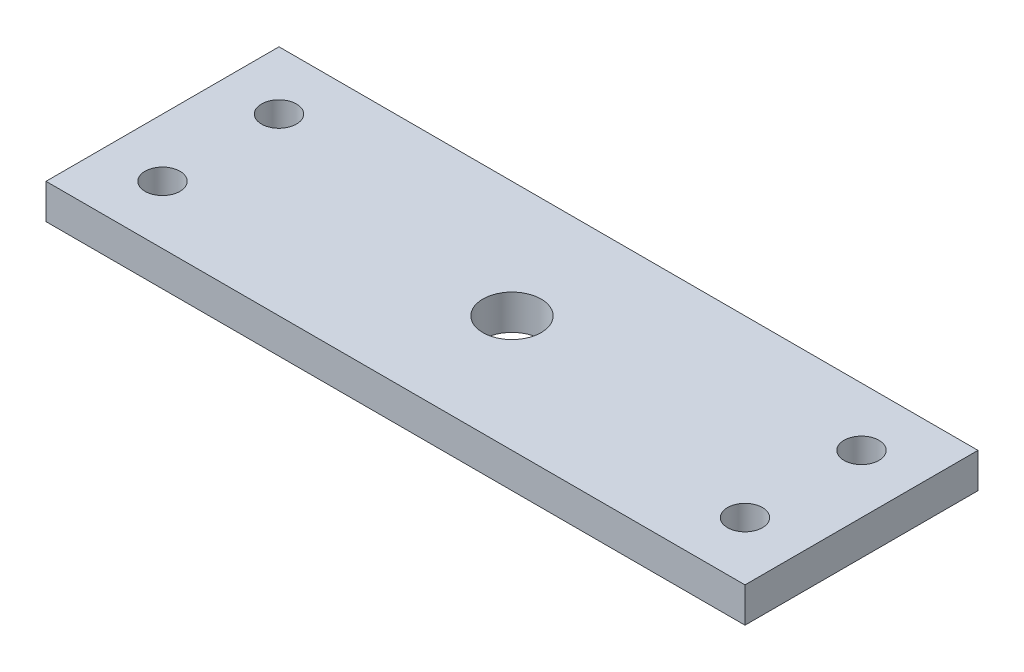
ISO-10303-21;
HEADER;
FILE_DESCRIPTION(('STEP AP214'),'2;1');
FILE_NAME('part.step','',(''),(''),'','','');
FILE_SCHEMA(('AUTOMOTIVE_DESIGN { 1 0 10303 214 1 1 1 1 }'));
ENDSEC;
DATA;
#1=APPLICATION_CONTEXT('core data for automotive mechanical design processes');
#2=APPLICATION_PROTOCOL_DEFINITION('international standard','automotive_design',2000,#1);
#3=PRODUCT_CONTEXT('',#1,'mechanical');
#4=PRODUCT('Part','Part','',(#3));
#5=PRODUCT_RELATED_PRODUCT_CATEGORY('part','',(#4));
#6=PRODUCT_DEFINITION_FORMATION('','',#4);
#7=PRODUCT_DEFINITION_CONTEXT('part definition',#1,'design');
#8=PRODUCT_DEFINITION('design','',#6,#7);
#9=PRODUCT_DEFINITION_SHAPE('','',#8);
#10=(LENGTH_UNIT() NAMED_UNIT(*) SI_UNIT(.MILLI.,.METRE.));
#11=(NAMED_UNIT(*) PLANE_ANGLE_UNIT() SI_UNIT($,.RADIAN.));
#12=(NAMED_UNIT(*) SI_UNIT($,.STERADIAN.) SOLID_ANGLE_UNIT());
#13=UNCERTAINTY_MEASURE_WITH_UNIT(LENGTH_MEASURE(1.E-05),#10,'distance_accuracy_value','');
#14=(GEOMETRIC_REPRESENTATION_CONTEXT(3) GLOBAL_UNCERTAINTY_ASSIGNED_CONTEXT((#13)) GLOBAL_UNIT_ASSIGNED_CONTEXT((#10,
#11,#12)) REPRESENTATION_CONTEXT('',''));
#15=CARTESIAN_POINT('',(0.,0.,0.));
#16=DIRECTION('',(0.,0.,1.));
#17=DIRECTION('',(1.,0.,0.));
#18=AXIS2_PLACEMENT_3D('',#15,#16,#17);
#19=CARTESIAN_POINT('',(0.,3.,0.));
#20=DIRECTION('',(0.,1.,0.));
#21=DIRECTION('',(0.,0.,1.));
#22=AXIS2_PLACEMENT_3D('',#19,#20,#21);
#23=PLANE('',#22);
#24=CARTESIAN_POINT('',(-5.,3.,-15.));
#25=DIRECTION('',(0.,1.,0.));
#26=DIRECTION('',(0.,0.,-1.));
#27=AXIS2_PLACEMENT_3D('',#24,#25,#26);
#28=CIRCLE('',#27,1.5);
#29=CARTESIAN_POINT('',(-5.,3.,-16.5));
#30=VERTEX_POINT('',#29);
#31=EDGE_CURVE('E154',#30,#30,#28,.T.);
#32=ORIENTED_EDGE('',*,*,#31,.F.);
#33=EDGE_LOOP('',(#32));
#34=FACE_BOUND('',#33,.T.);
#35=CARTESIAN_POINT('',(-55.,3.,-15.));
#36=DIRECTION('',(0.,1.,0.));
#37=DIRECTION('',(0.,0.,1.));
#38=AXIS2_PLACEMENT_3D('',#35,#36,#37);
#39=CIRCLE('',#38,1.5);
#40=CARTESIAN_POINT('',(-55.,3.,-13.5));
#41=VERTEX_POINT('',#40);
#42=EDGE_CURVE('E138',#41,#41,#39,.T.);
#43=ORIENTED_EDGE('',*,*,#42,.F.);
#44=EDGE_LOOP('',(#43));
#45=FACE_BOUND('',#44,.T.);
#46=DIRECTION('',(0.,0.,1.));
#47=VECTOR('',#46,1.);
#48=CARTESIAN_POINT('',(-60.,3.,-20.));
#49=LINE('',#48,#47);
#50=CARTESIAN_POINT('',(-60.,3.,-20.));
#51=VERTEX_POINT('',#50);
#52=CARTESIAN_POINT('',(-60.,3.,0.));
#53=VERTEX_POINT('',#52);
#54=EDGE_CURVE('E96',#51,#53,#49,.T.);
#55=ORIENTED_EDGE('',*,*,#54,.T.);
#56=DIRECTION('',(1.,0.,0.));
#57=VECTOR('',#56,1.);
#58=CARTESIAN_POINT('',(-60.,3.,0.));
#59=LINE('',#58,#57);
#60=CARTESIAN_POINT('',(0.,3.,0.));
#61=VERTEX_POINT('',#60);
#62=EDGE_CURVE('E91',#53,#61,#59,.T.);
#63=ORIENTED_EDGE('',*,*,#62,.T.);
#64=DIRECTION('',(0.,0.,-1.));
#65=VECTOR('',#64,1.);
#66=CARTESIAN_POINT('',(0.,3.,-20.));
#67=LINE('',#66,#65);
#68=CARTESIAN_POINT('',(0.,3.,-20.));
#69=VERTEX_POINT('',#68);
#70=EDGE_CURVE('E94',#61,#69,#67,.T.);
#71=ORIENTED_EDGE('',*,*,#70,.T.);
#72=DIRECTION('',(-1.,0.,0.));
#73=VECTOR('',#72,1.);
#74=CARTESIAN_POINT('',(-60.,3.,-20.));
#75=LINE('',#74,#73);
#76=EDGE_CURVE('E61',#69,#51,#75,.T.);
#77=ORIENTED_EDGE('',*,*,#76,.T.);
#78=EDGE_LOOP('',(#55,#63,#71,#77));
#79=FACE_BOUND('',#78,.T.);
#80=CARTESIAN_POINT('',(-30.,3.,-10.));
#81=DIRECTION('',(0.,1.,0.));
#82=DIRECTION('',(0.,0.,1.));
#83=AXIS2_PLACEMENT_3D('',#80,#81,#82);
#84=CIRCLE('',#83,2.5);
#85=CARTESIAN_POINT('',(-30.,3.,-7.5));
#86=VERTEX_POINT('',#85);
#87=EDGE_CURVE('E116',#86,#86,#84,.T.);
#88=ORIENTED_EDGE('',*,*,#87,.F.);
#89=EDGE_LOOP('',(#88));
#90=FACE_BOUND('',#89,.T.);
#91=CARTESIAN_POINT('',(-55.,3.,-4.99999999999999));
#92=DIRECTION('',(0.,1.,0.));
#93=DIRECTION('',(0.,0.,-1.));
#94=AXIS2_PLACEMENT_3D('',#91,#92,#93);
#95=CIRCLE('',#94,1.5);
#96=CARTESIAN_POINT('',(-55.,3.,-6.5));
#97=VERTEX_POINT('',#96);
#98=EDGE_CURVE('E146',#97,#97,#95,.T.);
#99=ORIENTED_EDGE('',*,*,#98,.F.);
#100=EDGE_LOOP('',(#99));
#101=FACE_BOUND('',#100,.T.);
#102=CARTESIAN_POINT('',(-5.,3.,-5.00000000000002));
#103=DIRECTION('',(0.,1.,0.));
#104=DIRECTION('',(0.,0.,1.));
#105=AXIS2_PLACEMENT_3D('',#102,#103,#104);
#106=CIRCLE('',#105,1.5);
#107=CARTESIAN_POINT('',(-5.,3.,-3.50000000000001));
#108=VERTEX_POINT('',#107);
#109=EDGE_CURVE('E162',#108,#108,#106,.T.);
#110=ORIENTED_EDGE('',*,*,#109,.F.);
#111=EDGE_LOOP('',(#110));
#112=FACE_BOUND('',#111,.T.);
#113=ADVANCED_FACE('F43',(#34,#45,#79,#90,#101,#112),#23,.T.);
#114=CARTESIAN_POINT('',(0.,0.,0.));
#115=DIRECTION('',(0.,1.,0.));
#116=DIRECTION('',(0.,0.,1.));
#117=AXIS2_PLACEMENT_3D('',#114,#115,#116);
#118=PLANE('',#117);
#119=DIRECTION('',(0.,0.,1.));
#120=VECTOR('',#119,1.);
#121=CARTESIAN_POINT('',(-60.,0.,-20.));
#122=LINE('',#121,#120);
#123=CARTESIAN_POINT('',(-60.,0.,-20.));
#124=VERTEX_POINT('',#123);
#125=CARTESIAN_POINT('',(-60.,0.,0.));
#126=VERTEX_POINT('',#125);
#127=EDGE_CURVE('E112',#124,#126,#122,.T.);
#128=ORIENTED_EDGE('',*,*,#127,.F.);
#129=DIRECTION('',(-1.,0.,0.));
#130=VECTOR('',#129,1.);
#131=CARTESIAN_POINT('',(-60.,0.,-20.));
#132=LINE('',#131,#130);
#133=CARTESIAN_POINT('',(0.,0.,-20.));
#134=VERTEX_POINT('',#133);
#135=EDGE_CURVE('E84',#134,#124,#132,.T.);
#136=ORIENTED_EDGE('',*,*,#135,.F.);
#137=DIRECTION('',(0.,0.,-1.));
#138=VECTOR('',#137,1.);
#139=CARTESIAN_POINT('',(0.,0.,-20.));
#140=LINE('',#139,#138);
#141=CARTESIAN_POINT('',(0.,0.,0.));
#142=VERTEX_POINT('',#141);
#143=EDGE_CURVE('E78',#142,#134,#140,.T.);
#144=ORIENTED_EDGE('',*,*,#143,.F.);
#145=DIRECTION('',(1.,0.,0.));
#146=VECTOR('',#145,1.);
#147=CARTESIAN_POINT('',(-60.,0.,0.));
#148=LINE('',#147,#146);
#149=EDGE_CURVE('E101',#126,#142,#148,.T.);
#150=ORIENTED_EDGE('',*,*,#149,.F.);
#151=EDGE_LOOP('',(#128,#136,#144,#150));
#152=FACE_BOUND('',#151,.T.);
#153=CARTESIAN_POINT('',(-30.,0.,-10.));
#154=DIRECTION('',(0.,1.,0.));
#155=DIRECTION('',(0.,0.,1.));
#156=AXIS2_PLACEMENT_3D('',#153,#154,#155);
#157=CIRCLE('',#156,2.5);
#158=CARTESIAN_POINT('',(-30.,0.,-7.5));
#159=VERTEX_POINT('',#158);
#160=EDGE_CURVE('E134',#159,#159,#157,.T.);
#161=ORIENTED_EDGE('',*,*,#160,.T.);
#162=EDGE_LOOP('',(#161));
#163=FACE_BOUND('',#162,.T.);
#164=CARTESIAN_POINT('',(-55.,0.,-15.));
#165=DIRECTION('',(0.,1.,0.));
#166=DIRECTION('',(0.,0.,1.));
#167=AXIS2_PLACEMENT_3D('',#164,#165,#166);
#168=CIRCLE('',#167,1.5);
#169=CARTESIAN_POINT('',(-55.,0.,-13.5));
#170=VERTEX_POINT('',#169);
#171=EDGE_CURVE('E142',#170,#170,#168,.T.);
#172=ORIENTED_EDGE('',*,*,#171,.T.);
#173=EDGE_LOOP('',(#172));
#174=FACE_BOUND('',#173,.T.);
#175=CARTESIAN_POINT('',(-55.,0.,-4.99999999999999));
#176=DIRECTION('',(0.,1.,0.));
#177=DIRECTION('',(0.,0.,-1.));
#178=AXIS2_PLACEMENT_3D('',#175,#176,#177);
#179=CIRCLE('',#178,1.5);
#180=CARTESIAN_POINT('',(-55.,0.,-6.5));
#181=VERTEX_POINT('',#180);
#182=EDGE_CURVE('E150',#181,#181,#179,.T.);
#183=ORIENTED_EDGE('',*,*,#182,.T.);
#184=EDGE_LOOP('',(#183));
#185=FACE_BOUND('',#184,.T.);
#186=CARTESIAN_POINT('',(-5.,0.,-15.));
#187=DIRECTION('',(0.,1.,0.));
#188=DIRECTION('',(0.,0.,-1.));
#189=AXIS2_PLACEMENT_3D('',#186,#187,#188);
#190=CIRCLE('',#189,1.5);
#191=CARTESIAN_POINT('',(-5.,0.,-16.5));
#192=VERTEX_POINT('',#191);
#193=EDGE_CURVE('E158',#192,#192,#190,.T.);
#194=ORIENTED_EDGE('',*,*,#193,.T.);
#195=EDGE_LOOP('',(#194));
#196=FACE_BOUND('',#195,.T.);
#197=CARTESIAN_POINT('',(-5.,0.,-5.00000000000002));
#198=DIRECTION('',(0.,1.,0.));
#199=DIRECTION('',(0.,0.,1.));
#200=AXIS2_PLACEMENT_3D('',#197,#198,#199);
#201=CIRCLE('',#200,1.5);
#202=CARTESIAN_POINT('',(-5.,0.,-3.50000000000001));
#203=VERTEX_POINT('',#202);
#204=EDGE_CURVE('E166',#203,#203,#201,.T.);
#205=ORIENTED_EDGE('',*,*,#204,.T.);
#206=EDGE_LOOP('',(#205));
#207=FACE_BOUND('',#206,.T.);
#208=ADVANCED_FACE('F129',(#152,#163,#174,#185,#196,#207),#118,.F.);
#209=CARTESIAN_POINT('',(-60.,3.,-20.));
#210=DIRECTION('',(1.,0.,0.));
#211=DIRECTION('',(0.,0.,-1.));
#212=AXIS2_PLACEMENT_3D('',#209,#210,#211);
#213=PLANE('',#212);
#214=ORIENTED_EDGE('',*,*,#127,.T.);
#215=DIRECTION('',(0.,-1.,0.));
#216=VECTOR('',#215,1.);
#217=CARTESIAN_POINT('',(-60.,3.,0.));
#218=LINE('',#217,#216);
#219=EDGE_CURVE('E11',#53,#126,#218,.T.);
#220=ORIENTED_EDGE('',*,*,#219,.F.);
#221=ORIENTED_EDGE('',*,*,#54,.F.);
#222=DIRECTION('',(0.,-1.,0.));
#223=VECTOR('',#222,1.);
#224=CARTESIAN_POINT('',(-60.,3.,-20.));
#225=LINE('',#224,#223);
#226=EDGE_CURVE('E108',#51,#124,#225,.T.);
#227=ORIENTED_EDGE('',*,*,#226,.T.);
#228=EDGE_LOOP('',(#214,#220,#221,#227));
#229=FACE_BOUND('',#228,.T.);
#230=ADVANCED_FACE('F45',(#229),#213,.F.);
#231=CARTESIAN_POINT('',(-60.,3.,0.));
#232=DIRECTION('',(0.,0.,-1.));
#233=DIRECTION('',(-1.,0.,0.));
#234=AXIS2_PLACEMENT_3D('',#231,#232,#233);
#235=PLANE('',#234);
#236=ORIENTED_EDGE('',*,*,#149,.T.);
#237=DIRECTION('',(0.,-1.,0.));
#238=VECTOR('',#237,1.);
#239=CARTESIAN_POINT('',(0.,3.,0.));
#240=LINE('',#239,#238);
#241=EDGE_CURVE('E53',#61,#142,#240,.T.);
#242=ORIENTED_EDGE('',*,*,#241,.F.);
#243=ORIENTED_EDGE('',*,*,#62,.F.);
#244=ORIENTED_EDGE('',*,*,#219,.T.);
#245=EDGE_LOOP('',(#236,#242,#243,#244));
#246=FACE_BOUND('',#245,.T.);
#247=ADVANCED_FACE('F100',(#246),#235,.F.);
#248=CARTESIAN_POINT('',(0.,3.,-20.));
#249=DIRECTION('',(-1.,0.,0.));
#250=DIRECTION('',(0.,0.,1.));
#251=AXIS2_PLACEMENT_3D('',#248,#249,#250);
#252=PLANE('',#251);
#253=ORIENTED_EDGE('',*,*,#143,.T.);
#254=DIRECTION('',(0.,-1.,0.));
#255=VECTOR('',#254,1.);
#256=CARTESIAN_POINT('',(0.,3.,-20.));
#257=LINE('',#256,#255);
#258=EDGE_CURVE('E103',#69,#134,#257,.T.);
#259=ORIENTED_EDGE('',*,*,#258,.F.);
#260=ORIENTED_EDGE('',*,*,#70,.F.);
#261=ORIENTED_EDGE('',*,*,#241,.T.);
#262=EDGE_LOOP('',(#253,#259,#260,#261));
#263=FACE_BOUND('',#262,.T.);
#264=ADVANCED_FACE('F104',(#263),#252,.F.);
#265=CARTESIAN_POINT('',(-60.,3.,-20.));
#266=DIRECTION('',(0.,0.,1.));
#267=DIRECTION('',(1.,0.,0.));
#268=AXIS2_PLACEMENT_3D('',#265,#266,#267);
#269=PLANE('',#268);
#270=ORIENTED_EDGE('',*,*,#135,.T.);
#271=ORIENTED_EDGE('',*,*,#226,.F.);
#272=ORIENTED_EDGE('',*,*,#76,.F.);
#273=ORIENTED_EDGE('',*,*,#258,.T.);
#274=EDGE_LOOP('',(#270,#271,#272,#273));
#275=FACE_BOUND('',#274,.T.);
#276=ADVANCED_FACE('F126',(#275),#269,.F.);
#277=CARTESIAN_POINT('',(-30.,3.,-10.));
#278=DIRECTION('',(0.,-1.,0.));
#279=DIRECTION('',(0.,0.,-1.));
#280=AXIS2_PLACEMENT_3D('',#277,#278,#279);
#281=CYLINDRICAL_SURFACE('',#280,2.5);
#282=ORIENTED_EDGE('',*,*,#87,.T.);
#283=EDGE_LOOP('',(#282));
#284=FACE_BOUND('',#283,.T.);
#285=ORIENTED_EDGE('',*,*,#160,.F.);
#286=EDGE_LOOP('',(#285));
#287=FACE_BOUND('',#286,.T.);
#288=ADVANCED_FACE('F187',(#284,#287),#281,.F.);
#289=CARTESIAN_POINT('',(-55.,3.,-15.));
#290=DIRECTION('',(0.,-1.,0.));
#291=DIRECTION('',(0.,0.,-1.));
#292=AXIS2_PLACEMENT_3D('',#289,#290,#291);
#293=CYLINDRICAL_SURFACE('',#292,1.5);
#294=ORIENTED_EDGE('',*,*,#42,.T.);
#295=EDGE_LOOP('',(#294));
#296=FACE_BOUND('',#295,.T.);
#297=ORIENTED_EDGE('',*,*,#171,.F.);
#298=EDGE_LOOP('',(#297));
#299=FACE_BOUND('',#298,.T.);
#300=ADVANCED_FACE('F241',(#296,#299),#293,.F.);
#301=CARTESIAN_POINT('',(-55.,3.,-4.99999999999999));
#302=DIRECTION('',(0.,-1.,0.));
#303=DIRECTION('',(0.,0.,-1.));
#304=AXIS2_PLACEMENT_3D('',#301,#302,#303);
#305=CYLINDRICAL_SURFACE('',#304,1.5);
#306=ORIENTED_EDGE('',*,*,#98,.T.);
#307=EDGE_LOOP('',(#306));
#308=FACE_BOUND('',#307,.T.);
#309=ORIENTED_EDGE('',*,*,#182,.F.);
#310=EDGE_LOOP('',(#309));
#311=FACE_BOUND('',#310,.T.);
#312=ADVANCED_FACE('F250',(#308,#311),#305,.F.);
#313=CARTESIAN_POINT('',(-5.,3.,-15.));
#314=DIRECTION('',(0.,-1.,0.));
#315=DIRECTION('',(0.,0.,-1.));
#316=AXIS2_PLACEMENT_3D('',#313,#314,#315);
#317=CYLINDRICAL_SURFACE('',#316,1.5);
#318=ORIENTED_EDGE('',*,*,#31,.T.);
#319=EDGE_LOOP('',(#318));
#320=FACE_BOUND('',#319,.T.);
#321=ORIENTED_EDGE('',*,*,#193,.F.);
#322=EDGE_LOOP('',(#321));
#323=FACE_BOUND('',#322,.T.);
#324=ADVANCED_FACE('F259',(#320,#323),#317,.F.);
#325=CARTESIAN_POINT('',(-5.,3.,-5.00000000000002));
#326=DIRECTION('',(0.,-1.,0.));
#327=DIRECTION('',(0.,0.,-1.));
#328=AXIS2_PLACEMENT_3D('',#325,#326,#327);
#329=CYLINDRICAL_SURFACE('',#328,1.5);
#330=ORIENTED_EDGE('',*,*,#109,.T.);
#331=EDGE_LOOP('',(#330));
#332=FACE_BOUND('',#331,.T.);
#333=ORIENTED_EDGE('',*,*,#204,.F.);
#334=EDGE_LOOP('',(#333));
#335=FACE_BOUND('',#334,.T.);
#336=ADVANCED_FACE('F174',(#332,#335),#329,.F.);
#337=CLOSED_SHELL('',(#113,#208,#230,#247,#264,#276,#288,#300,#312,#324,#336));
#338=MANIFOLD_SOLID_BREP('B2',#337);
#339=ADVANCED_BREP_SHAPE_REPRESENTATION('',(#18,#338),#14);
#340=SHAPE_DEFINITION_REPRESENTATION(#9,#339);
ENDSEC;
END-ISO-10303-21;
